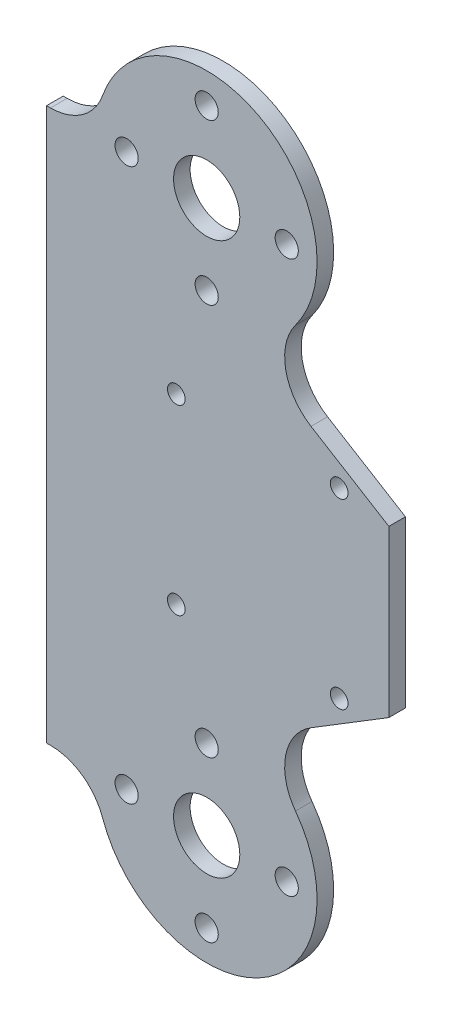
ISO-10303-21;
HEADER;
FILE_DESCRIPTION(('STEP AP214'),'2;1');
FILE_NAME('part.step','',(''),(''),'','','');
FILE_SCHEMA(('AUTOMOTIVE_DESIGN { 1 0 10303 214 1 1 1 1 }'));
ENDSEC;
DATA;
#1=APPLICATION_CONTEXT('core data for automotive mechanical design processes');
#2=APPLICATION_PROTOCOL_DEFINITION('international standard','automotive_design',2000,#1);
#3=PRODUCT_CONTEXT('',#1,'mechanical');
#4=PRODUCT('Part','Part','',(#3));
#5=PRODUCT_RELATED_PRODUCT_CATEGORY('part','',(#4));
#6=PRODUCT_DEFINITION_FORMATION('','',#4);
#7=PRODUCT_DEFINITION_CONTEXT('part definition',#1,'design');
#8=PRODUCT_DEFINITION('design','',#6,#7);
#9=PRODUCT_DEFINITION_SHAPE('','',#8);
#10=(LENGTH_UNIT() NAMED_UNIT(*) SI_UNIT(.MILLI.,.METRE.));
#11=(NAMED_UNIT(*) PLANE_ANGLE_UNIT() SI_UNIT($,.RADIAN.));
#12=(NAMED_UNIT(*) SI_UNIT($,.STERADIAN.) SOLID_ANGLE_UNIT());
#13=UNCERTAINTY_MEASURE_WITH_UNIT(LENGTH_MEASURE(1.E-05),#10,'distance_accuracy_value','');
#14=(GEOMETRIC_REPRESENTATION_CONTEXT(3) GLOBAL_UNCERTAINTY_ASSIGNED_CONTEXT((#13)) GLOBAL_UNIT_ASSIGNED_CONTEXT((#10,
#11,#12)) REPRESENTATION_CONTEXT('',''));
#15=CARTESIAN_POINT('',(0.,0.,0.));
#16=DIRECTION('',(0.,0.,1.));
#17=DIRECTION('',(1.,0.,0.));
#18=AXIS2_PLACEMENT_3D('',#15,#16,#17);
#19=CARTESIAN_POINT('',(-29.,-50.,3.));
#20=DIRECTION('',(0.,1.,0.));
#21=DIRECTION('',(0.,0.,1.));
#22=AXIS2_PLACEMENT_3D('',#19,#20,#21);
#23=PLANE('',#22);
#24=DIRECTION('',(0.,0.,-1.));
#25=VECTOR('',#24,1.);
#26=CARTESIAN_POINT('',(0.,-50.,3.));
#27=LINE('',#26,#25);
#28=CARTESIAN_POINT('',(0.,-50.,3.));
#29=VERTEX_POINT('',#28);
#30=CARTESIAN_POINT('',(0.,-50.,0.));
#31=VERTEX_POINT('',#30);
#32=EDGE_CURVE('E162',#29,#31,#27,.T.);
#33=ORIENTED_EDGE('',*,*,#32,.T.);
#34=DIRECTION('',(-1.,0.,0.));
#35=VECTOR('',#34,1.);
#36=CARTESIAN_POINT('',(0.,-50.,0.));
#37=LINE('',#36,#35);
#38=CARTESIAN_POINT('',(0.71572875253809,-50.,0.));
#39=VERTEX_POINT('',#38);
#40=EDGE_CURVE('E126',#39,#31,#37,.T.);
#41=ORIENTED_EDGE('',*,*,#40,.F.);
#42=DIRECTION('',(0.,0.,1.));
#43=VECTOR('',#42,1.);
#44=CARTESIAN_POINT('',(0.715728752538087,-50.,-56.5685424949239));
#45=LINE('',#44,#43);
#46=CARTESIAN_POINT('',(0.71572875253809,-50.,3.));
#47=VERTEX_POINT('',#46);
#48=EDGE_CURVE('E266',#39,#47,#45,.T.);
#49=ORIENTED_EDGE('',*,*,#48,.T.);
#50=DIRECTION('',(1.,0.,0.));
#51=VECTOR('',#50,1.);
#52=CARTESIAN_POINT('',(-29.,-50.,3.));
#53=LINE('',#52,#51);
#54=EDGE_CURVE('E134',#29,#47,#53,.T.);
#55=ORIENTED_EDGE('',*,*,#54,.F.);
#56=EDGE_LOOP('',(#33,#41,#49,#55));
#57=FACE_BOUND('',#56,.T.);
#58=ADVANCED_FACE('F17',(#57),#23,.F.);
#59=CARTESIAN_POINT('',(-29.,50.,3.));
#60=DIRECTION('',(0.,1.,0.));
#61=DIRECTION('',(0.,0.,1.));
#62=AXIS2_PLACEMENT_3D('',#59,#60,#61);
#63=PLANE('',#62);
#64=DIRECTION('',(0.,0.,1.));
#65=VECTOR('',#64,1.);
#66=CARTESIAN_POINT('',(0.715728752538082,50.,-56.5685424949239));
#67=LINE('',#66,#65);
#68=CARTESIAN_POINT('',(0.715728752538088,50.,3.));
#69=VERTEX_POINT('',#68);
#70=CARTESIAN_POINT('',(0.715728752538088,50.,0.));
#71=VERTEX_POINT('',#70);
#72=EDGE_CURVE('E115',#69,#71,#67,.F.);
#73=ORIENTED_EDGE('',*,*,#72,.T.);
#74=DIRECTION('',(-1.,0.,0.));
#75=VECTOR('',#74,1.);
#76=CARTESIAN_POINT('',(0.,50.,0.));
#77=LINE('',#76,#75);
#78=CARTESIAN_POINT('',(0.,50.,0.));
#79=VERTEX_POINT('',#78);
#80=EDGE_CURVE('E94',#79,#71,#77,.F.);
#81=ORIENTED_EDGE('',*,*,#80,.F.);
#82=DIRECTION('',(0.,0.,-1.));
#83=VECTOR('',#82,1.);
#84=CARTESIAN_POINT('',(0.,50.,3.));
#85=LINE('',#84,#83);
#86=CARTESIAN_POINT('',(0.,50.,3.));
#87=VERTEX_POINT('',#86);
#88=EDGE_CURVE('E161',#79,#87,#85,.F.);
#89=ORIENTED_EDGE('',*,*,#88,.T.);
#90=DIRECTION('',(1.,0.,0.));
#91=VECTOR('',#90,1.);
#92=CARTESIAN_POINT('',(-29.,50.,3.));
#93=LINE('',#92,#91);
#94=EDGE_CURVE('E35',#87,#69,#93,.T.);
#95=ORIENTED_EDGE('',*,*,#94,.T.);
#96=EDGE_LOOP('',(#73,#81,#89,#95));
#97=FACE_BOUND('',#96,.T.);
#98=ADVANCED_FACE('F390',(#97),#63,.T.);
#99=CARTESIAN_POINT('',(0.,0.,0.));
#100=DIRECTION('',(0.,0.,-1.));
#101=DIRECTION('',(-1.,0.,0.));
#102=AXIS2_PLACEMENT_3D('',#99,#100,#101);
#103=PLANE('',#102);
#104=CARTESIAN_POINT('',(29.,50.,0.));
#105=DIRECTION('',(0.,0.,1.));
#106=DIRECTION('',(1.,0.,0.));
#107=AXIS2_PLACEMENT_3D('',#104,#105,#106);
#108=CIRCLE('',#107,6.00000000000001);
#109=CARTESIAN_POINT('',(35.,50.,0.));
#110=VERTEX_POINT('',#109);
#111=EDGE_CURVE('E233',#110,#110,#108,.T.);
#112=ORIENTED_EDGE('',*,*,#111,.T.);
#113=EDGE_LOOP('',(#112));
#114=FACE_BOUND('',#113,.T.);
#115=CARTESIAN_POINT('',(29.,-50.,0.));
#116=DIRECTION('',(0.,0.,1.));
#117=DIRECTION('',(1.,0.,0.));
#118=AXIS2_PLACEMENT_3D('',#115,#116,#117);
#119=CIRCLE('',#118,6.00000000000001);
#120=CARTESIAN_POINT('',(35.,-50.,0.));
#121=VERTEX_POINT('',#120);
#122=EDGE_CURVE('E236',#121,#121,#119,.T.);
#123=ORIENTED_EDGE('',*,*,#122,.T.);
#124=EDGE_LOOP('',(#123));
#125=FACE_BOUND('',#124,.T.);
#126=CARTESIAN_POINT('',(29.,-35.5,0.));
#127=DIRECTION('',(0.,0.,1.));
#128=DIRECTION('',(1.,0.,0.));
#129=AXIS2_PLACEMENT_3D('',#126,#127,#128);
#130=CIRCLE('',#129,2.09999999999999);
#131=CARTESIAN_POINT('',(31.1,-35.5,0.));
#132=VERTEX_POINT('',#131);
#133=EDGE_CURVE('E239',#132,#132,#130,.T.);
#134=ORIENTED_EDGE('',*,*,#133,.T.);
#135=EDGE_LOOP('',(#134));
#136=FACE_BOUND('',#135,.T.);
#137=CARTESIAN_POINT('',(29.,64.5,0.));
#138=DIRECTION('',(0.,0.,1.));
#139=DIRECTION('',(1.,0.,0.));
#140=AXIS2_PLACEMENT_3D('',#137,#138,#139);
#141=CIRCLE('',#140,2.1);
#142=CARTESIAN_POINT('',(31.1,64.5,0.));
#143=VERTEX_POINT('',#142);
#144=EDGE_CURVE('E242',#143,#143,#141,.T.);
#145=ORIENTED_EDGE('',*,*,#144,.T.);
#146=EDGE_LOOP('',(#145));
#147=FACE_BOUND('',#146,.T.);
#148=CARTESIAN_POINT('',(14.5,-50.,0.));
#149=DIRECTION('',(0.,0.,1.));
#150=DIRECTION('',(1.,0.,0.));
#151=AXIS2_PLACEMENT_3D('',#148,#149,#150);
#152=CIRCLE('',#151,2.1);
#153=CARTESIAN_POINT('',(16.6,-50.,0.));
#154=VERTEX_POINT('',#153);
#155=EDGE_CURVE('E245',#154,#154,#152,.T.);
#156=ORIENTED_EDGE('',*,*,#155,.T.);
#157=EDGE_LOOP('',(#156));
#158=FACE_BOUND('',#157,.T.);
#159=CARTESIAN_POINT('',(29.,-64.5,0.));
#160=DIRECTION('',(0.,0.,1.));
#161=DIRECTION('',(1.,0.,0.));
#162=AXIS2_PLACEMENT_3D('',#159,#160,#161);
#163=CIRCLE('',#162,2.1);
#164=CARTESIAN_POINT('',(31.1,-64.5,0.));
#165=VERTEX_POINT('',#164);
#166=EDGE_CURVE('E248',#165,#165,#163,.T.);
#167=ORIENTED_EDGE('',*,*,#166,.T.);
#168=EDGE_LOOP('',(#167));
#169=FACE_BOUND('',#168,.T.);
#170=CARTESIAN_POINT('',(43.5,-50.,0.));
#171=DIRECTION('',(0.,0.,1.));
#172=DIRECTION('',(1.,0.,0.));
#173=AXIS2_PLACEMENT_3D('',#170,#171,#172);
#174=CIRCLE('',#173,2.1);
#175=CARTESIAN_POINT('',(45.6,-50.,0.));
#176=VERTEX_POINT('',#175);
#177=EDGE_CURVE('E251',#176,#176,#174,.T.);
#178=ORIENTED_EDGE('',*,*,#177,.T.);
#179=EDGE_LOOP('',(#178));
#180=FACE_BOUND('',#179,.T.);
#181=CARTESIAN_POINT('',(43.5,50.,0.));
#182=DIRECTION('',(0.,0.,1.));
#183=DIRECTION('',(1.,0.,0.));
#184=AXIS2_PLACEMENT_3D('',#181,#182,#183);
#185=CIRCLE('',#184,2.09999999999999);
#186=CARTESIAN_POINT('',(45.6,50.,0.));
#187=VERTEX_POINT('',#186);
#188=EDGE_CURVE('E254',#187,#187,#185,.T.);
#189=ORIENTED_EDGE('',*,*,#188,.T.);
#190=EDGE_LOOP('',(#189));
#191=FACE_BOUND('',#190,.T.);
#192=CARTESIAN_POINT('',(14.5,50.,0.));
#193=DIRECTION('',(0.,0.,1.));
#194=DIRECTION('',(1.,0.,0.));
#195=AXIS2_PLACEMENT_3D('',#192,#193,#194);
#196=CIRCLE('',#195,2.1);
#197=CARTESIAN_POINT('',(16.6,50.,0.));
#198=VERTEX_POINT('',#197);
#199=EDGE_CURVE('E257',#198,#198,#196,.T.);
#200=ORIENTED_EDGE('',*,*,#199,.T.);
#201=EDGE_LOOP('',(#200));
#202=FACE_BOUND('',#201,.T.);
#203=CARTESIAN_POINT('',(29.,35.5,0.));
#204=DIRECTION('',(0.,0.,1.));
#205=DIRECTION('',(1.,0.,0.));
#206=AXIS2_PLACEMENT_3D('',#203,#204,#205);
#207=CIRCLE('',#206,2.09999999999999);
#208=CARTESIAN_POINT('',(31.1,35.5,0.));
#209=VERTEX_POINT('',#208);
#210=EDGE_CURVE('E171',#209,#209,#207,.T.);
#211=ORIENTED_EDGE('',*,*,#210,.T.);
#212=EDGE_LOOP('',(#211));
#213=FACE_BOUND('',#212,.T.);
#214=CARTESIAN_POINT('',(53.0000000000001,-16.4999999999999,0.));
#215=DIRECTION('',(0.,0.,1.));
#216=DIRECTION('',(1.,0.,0.));
#217=AXIS2_PLACEMENT_3D('',#214,#215,#216);
#218=CIRCLE('',#217,1.6);
#219=CARTESIAN_POINT('',(54.6000000000001,-16.4999999999999,0.));
#220=VERTEX_POINT('',#219);
#221=EDGE_CURVE('E125',#220,#220,#218,.T.);
#222=ORIENTED_EDGE('',*,*,#221,.T.);
#223=EDGE_LOOP('',(#222));
#224=FACE_BOUND('',#223,.T.);
#225=CARTESIAN_POINT('',(23.5000000000001,-16.5,0.));
#226=DIRECTION('',(0.,0.,1.));
#227=DIRECTION('',(1.,0.,0.));
#228=AXIS2_PLACEMENT_3D('',#225,#226,#227);
#229=CIRCLE('',#228,1.6);
#230=CARTESIAN_POINT('',(25.1000000000001,-16.5,0.));
#231=VERTEX_POINT('',#230);
#232=EDGE_CURVE('E275',#231,#231,#229,.T.);
#233=ORIENTED_EDGE('',*,*,#232,.T.);
#234=EDGE_LOOP('',(#233));
#235=FACE_BOUND('',#234,.T.);
#236=CARTESIAN_POINT('',(23.5,16.5,0.));
#237=DIRECTION('',(0.,0.,1.));
#238=DIRECTION('',(1.,0.,0.));
#239=AXIS2_PLACEMENT_3D('',#236,#237,#238);
#240=CIRCLE('',#239,1.6);
#241=CARTESIAN_POINT('',(25.1,16.5,0.));
#242=VERTEX_POINT('',#241);
#243=EDGE_CURVE('E277',#242,#242,#240,.T.);
#244=ORIENTED_EDGE('',*,*,#243,.T.);
#245=EDGE_LOOP('',(#244));
#246=FACE_BOUND('',#245,.T.);
#247=CARTESIAN_POINT('',(53.,16.5000000000001,0.));
#248=DIRECTION('',(0.,0.,1.));
#249=DIRECTION('',(1.,0.,0.));
#250=AXIS2_PLACEMENT_3D('',#247,#248,#249);
#251=CIRCLE('',#250,1.6);
#252=CARTESIAN_POINT('',(54.6,16.5000000000001,0.));
#253=VERTEX_POINT('',#252);
#254=EDGE_CURVE('E20',#253,#253,#251,.T.);
#255=ORIENTED_EDGE('',*,*,#254,.T.);
#256=EDGE_LOOP('',(#255));
#257=FACE_BOUND('',#256,.T.);
#258=CARTESIAN_POINT('',(0.715728752538093,-60.,0.));
#259=DIRECTION('',(0.,0.,1.));
#260=DIRECTION('',(1.,0.,0.));
#261=AXIS2_PLACEMENT_3D('',#258,#259,#260);
#262=CIRCLE('',#261,10.);
#263=CARTESIAN_POINT('',(10.1438191683587,-56.6666666666667,0.));
#264=VERTEX_POINT('',#263);
#265=EDGE_CURVE('E167',#264,#39,#262,.T.);
#266=ORIENTED_EDGE('',*,*,#265,.T.);
#267=ORIENTED_EDGE('',*,*,#40,.T.);
#268=DIRECTION('',(0.,1.,0.));
#269=VECTOR('',#268,1.);
#270=CARTESIAN_POINT('',(0.,-76.6594091653374,0.));
#271=LINE('',#270,#269);
#272=EDGE_CURVE('E159',#31,#79,#271,.T.);
#273=ORIENTED_EDGE('',*,*,#272,.T.);
#274=ORIENTED_EDGE('',*,*,#80,.T.);
#275=CARTESIAN_POINT('',(0.715728752538093,60.,0.));
#276=DIRECTION('',(0.,0.,1.));
#277=DIRECTION('',(1.,0.,0.));
#278=AXIS2_PLACEMENT_3D('',#275,#276,#277);
#279=CIRCLE('',#278,10.);
#280=CARTESIAN_POINT('',(10.1438191683587,56.6666666666667,0.));
#281=VERTEX_POINT('',#280);
#282=EDGE_CURVE('E109',#71,#281,#279,.T.);
#283=ORIENTED_EDGE('',*,*,#282,.T.);
#284=CARTESIAN_POINT('',(29.,50.,0.));
#285=DIRECTION('',(0.,0.,1.));
#286=DIRECTION('',(1.,0.,0.));
#287=AXIS2_PLACEMENT_3D('',#284,#285,#286);
#288=CIRCLE('',#287,20.);
#289=CARTESIAN_POINT('',(45.0842166639863,38.1131175531199,0.));
#290=VERTEX_POINT('',#289);
#291=EDGE_CURVE('E99',#290,#281,#288,.T.);
#292=ORIENTED_EDGE('',*,*,#291,.F.);
#293=CARTESIAN_POINT('',(53.1263249959794,32.1696763296798,0.));
#294=DIRECTION('',(0.,0.,1.));
#295=DIRECTION('',(1.,0.,0.));
#296=AXIS2_PLACEMENT_3D('',#293,#294,#295);
#297=CIRCLE('',#296,9.99999999999999);
#298=CARTESIAN_POINT('',(47.899755020674,23.6442457661695,0.));
#299=VERTEX_POINT('',#298);
#300=EDGE_CURVE('E153',#290,#299,#297,.T.);
#301=ORIENTED_EDGE('',*,*,#300,.T.);
#302=DIRECTION('',(-0.852543056351032,0.522656997530542,0.));
#303=VECTOR('',#302,1.);
#304=CARTESIAN_POINT('',(62.,15.,0.));
#305=LINE('',#304,#303);
#306=CARTESIAN_POINT('',(62.,15.,0.));
#307=VERTEX_POINT('',#306);
#308=EDGE_CURVE('E151',#307,#299,#305,.T.);
#309=ORIENTED_EDGE('',*,*,#308,.F.);
#310=DIRECTION('',(0.,1.,0.));
#311=VECTOR('',#310,1.);
#312=CARTESIAN_POINT('',(62.,15.,0.));
#313=LINE('',#312,#311);
#314=CARTESIAN_POINT('',(62.,-15.,0.));
#315=VERTEX_POINT('',#314);
#316=EDGE_CURVE('E145',#315,#307,#313,.T.);
#317=ORIENTED_EDGE('',*,*,#316,.F.);
#318=DIRECTION('',(0.852543056351032,0.522656997530541,0.));
#319=VECTOR('',#318,1.);
#320=CARTESIAN_POINT('',(62.,-15.,0.));
#321=LINE('',#320,#319);
#322=CARTESIAN_POINT('',(47.899755020674,-23.6442457661695,0.));
#323=VERTEX_POINT('',#322);
#324=EDGE_CURVE('E138',#323,#315,#321,.T.);
#325=ORIENTED_EDGE('',*,*,#324,.F.);
#326=CARTESIAN_POINT('',(53.1263249959794,-32.1696763296798,0.));
#327=DIRECTION('',(0.,0.,1.));
#328=DIRECTION('',(1.,0.,0.));
#329=AXIS2_PLACEMENT_3D('',#326,#327,#328);
#330=CIRCLE('',#329,9.99999999999999);
#331=CARTESIAN_POINT('',(45.0842166639863,-38.1131175531199,0.));
#332=VERTEX_POINT('',#331);
#333=EDGE_CURVE('E268',#323,#332,#330,.T.);
#334=ORIENTED_EDGE('',*,*,#333,.T.);
#335=CARTESIAN_POINT('',(29.,-50.,0.));
#336=DIRECTION('',(0.,0.,1.));
#337=DIRECTION('',(1.,0.,0.));
#338=AXIS2_PLACEMENT_3D('',#335,#336,#337);
#339=CIRCLE('',#338,20.);
#340=EDGE_CURVE('E264',#264,#332,#339,.T.);
#341=ORIENTED_EDGE('',*,*,#340,.F.);
#342=EDGE_LOOP('',(#266,#267,#273,#274,#283,#292,#301,#309,#317,#325,#334,#341));
#343=FACE_BOUND('',#342,.T.);
#344=ADVANCED_FACE('F111',(#114,#125,#136,#147,#158,#169,#180,#191,#202,#213,#224,#235,#246,
#257,#343),#103,.T.);
#345=CARTESIAN_POINT('',(53.,16.5000000000001,0.));
#346=DIRECTION('',(0.,0.,1.));
#347=DIRECTION('',(1.,0.,0.));
#348=AXIS2_PLACEMENT_3D('',#345,#346,#347);
#349=CYLINDRICAL_SURFACE('',#348,1.6);
#350=ORIENTED_EDGE('',*,*,#254,.F.);
#351=EDGE_LOOP('',(#350));
#352=FACE_BOUND('',#351,.T.);
#353=CARTESIAN_POINT('',(53.,16.5000000000001,3.));
#354=DIRECTION('',(0.,0.,1.));
#355=DIRECTION('',(1.,0.,0.));
#356=AXIS2_PLACEMENT_3D('',#353,#354,#355);
#357=CIRCLE('',#356,1.6);
#358=CARTESIAN_POINT('',(54.6,16.5000000000001,3.));
#359=VERTEX_POINT('',#358);
#360=EDGE_CURVE('E230',#359,#359,#357,.T.);
#361=ORIENTED_EDGE('',*,*,#360,.T.);
#362=EDGE_LOOP('',(#361));
#363=FACE_BOUND('',#362,.T.);
#364=ADVANCED_FACE('F285',(#352,#363),#349,.F.);
#365=CARTESIAN_POINT('',(23.5,16.5,0.));
#366=DIRECTION('',(0.,0.,1.));
#367=DIRECTION('',(1.,0.,0.));
#368=AXIS2_PLACEMENT_3D('',#365,#366,#367);
#369=CYLINDRICAL_SURFACE('',#368,1.6);
#370=ORIENTED_EDGE('',*,*,#243,.F.);
#371=EDGE_LOOP('',(#370));
#372=FACE_BOUND('',#371,.T.);
#373=CARTESIAN_POINT('',(23.5,16.5,3.));
#374=DIRECTION('',(0.,0.,1.));
#375=DIRECTION('',(1.,0.,0.));
#376=AXIS2_PLACEMENT_3D('',#373,#374,#375);
#377=CIRCLE('',#376,1.6);
#378=CARTESIAN_POINT('',(25.1,16.5,3.));
#379=VERTEX_POINT('',#378);
#380=EDGE_CURVE('E227',#379,#379,#377,.T.);
#381=ORIENTED_EDGE('',*,*,#380,.T.);
#382=EDGE_LOOP('',(#381));
#383=FACE_BOUND('',#382,.T.);
#384=ADVANCED_FACE('F288',(#372,#383),#369,.F.);
#385=CARTESIAN_POINT('',(23.5000000000001,-16.5,0.));
#386=DIRECTION('',(0.,0.,1.));
#387=DIRECTION('',(1.,0.,0.));
#388=AXIS2_PLACEMENT_3D('',#385,#386,#387);
#389=CYLINDRICAL_SURFACE('',#388,1.6);
#390=ORIENTED_EDGE('',*,*,#232,.F.);
#391=EDGE_LOOP('',(#390));
#392=FACE_BOUND('',#391,.T.);
#393=CARTESIAN_POINT('',(23.5000000000001,-16.5,3.));
#394=DIRECTION('',(0.,0.,1.));
#395=DIRECTION('',(1.,0.,0.));
#396=AXIS2_PLACEMENT_3D('',#393,#394,#395);
#397=CIRCLE('',#396,1.6);
#398=CARTESIAN_POINT('',(25.1000000000001,-16.5,3.));
#399=VERTEX_POINT('',#398);
#400=EDGE_CURVE('E224',#399,#399,#397,.T.);
#401=ORIENTED_EDGE('',*,*,#400,.T.);
#402=EDGE_LOOP('',(#401));
#403=FACE_BOUND('',#402,.T.);
#404=ADVANCED_FACE('F381',(#392,#403),#389,.F.);
#405=CARTESIAN_POINT('',(53.0000000000001,-16.4999999999999,0.));
#406=DIRECTION('',(0.,0.,1.));
#407=DIRECTION('',(1.,0.,0.));
#408=AXIS2_PLACEMENT_3D('',#405,#406,#407);
#409=CYLINDRICAL_SURFACE('',#408,1.6);
#410=ORIENTED_EDGE('',*,*,#221,.F.);
#411=EDGE_LOOP('',(#410));
#412=FACE_BOUND('',#411,.T.);
#413=CARTESIAN_POINT('',(53.0000000000001,-16.4999999999999,3.));
#414=DIRECTION('',(0.,0.,1.));
#415=DIRECTION('',(1.,0.,0.));
#416=AXIS2_PLACEMENT_3D('',#413,#414,#415);
#417=CIRCLE('',#416,1.6);
#418=CARTESIAN_POINT('',(54.6000000000001,-16.4999999999999,3.));
#419=VERTEX_POINT('',#418);
#420=EDGE_CURVE('E221',#419,#419,#417,.T.);
#421=ORIENTED_EDGE('',*,*,#420,.T.);
#422=EDGE_LOOP('',(#421));
#423=FACE_BOUND('',#422,.T.);
#424=ADVANCED_FACE('F378',(#412,#423),#409,.F.);
#425=CARTESIAN_POINT('',(0.715728752538093,60.,-56.5685424949239));
#426=DIRECTION('',(0.,0.,1.));
#427=DIRECTION('',(1.,0.,0.));
#428=AXIS2_PLACEMENT_3D('',#425,#426,#427);
#429=CYLINDRICAL_SURFACE('',#428,10.);
#430=ORIENTED_EDGE('',*,*,#72,.F.);
#431=CARTESIAN_POINT('',(0.715728752538093,60.,3.));
#432=DIRECTION('',(0.,0.,1.));
#433=DIRECTION('',(1.,0.,0.));
#434=AXIS2_PLACEMENT_3D('',#431,#432,#433);
#435=CIRCLE('',#434,10.);
#436=CARTESIAN_POINT('',(10.1438191683587,56.6666666666667,3.));
#437=VERTEX_POINT('',#436);
#438=EDGE_CURVE('E119',#69,#437,#435,.T.);
#439=ORIENTED_EDGE('',*,*,#438,.T.);
#440=DIRECTION('',(0.,0.,1.));
#441=VECTOR('',#440,1.);
#442=CARTESIAN_POINT('',(10.1438191683587,56.6666666666667,-56.5685424949239));
#443=LINE('',#442,#441);
#444=EDGE_CURVE('E102',#281,#437,#443,.T.);
#445=ORIENTED_EDGE('',*,*,#444,.F.);
#446=ORIENTED_EDGE('',*,*,#282,.F.);
#447=EDGE_LOOP('',(#430,#439,#445,#446));
#448=FACE_BOUND('',#447,.T.);
#449=ADVANCED_FACE('F118',(#448),#429,.F.);
#450=CARTESIAN_POINT('',(29.,50.,-56.5685424949239));
#451=DIRECTION('',(0.,0.,1.));
#452=DIRECTION('',(1.,0.,0.));
#453=AXIS2_PLACEMENT_3D('',#450,#451,#452);
#454=CYLINDRICAL_SURFACE('',#453,20.);
#455=CARTESIAN_POINT('',(29.,50.,3.));
#456=DIRECTION('',(0.,0.,1.));
#457=DIRECTION('',(1.,0.,0.));
#458=AXIS2_PLACEMENT_3D('',#455,#456,#457);
#459=CIRCLE('',#458,20.);
#460=CARTESIAN_POINT('',(45.0842166639863,38.1131175531199,3.));
#461=VERTEX_POINT('',#460);
#462=EDGE_CURVE('E218',#437,#461,#459,.F.);
#463=ORIENTED_EDGE('',*,*,#462,.T.);
#464=DIRECTION('',(0.,0.,1.));
#465=VECTOR('',#464,1.);
#466=CARTESIAN_POINT('',(45.0842166639863,38.1131175531199,-56.5685424949239));
#467=LINE('',#466,#465);
#468=EDGE_CURVE('E105',#461,#290,#467,.F.);
#469=ORIENTED_EDGE('',*,*,#468,.T.);
#470=ORIENTED_EDGE('',*,*,#291,.T.);
#471=ORIENTED_EDGE('',*,*,#444,.T.);
#472=EDGE_LOOP('',(#463,#469,#470,#471));
#473=FACE_BOUND('',#472,.T.);
#474=ADVANCED_FACE('F100',(#473),#454,.T.);
#475=CARTESIAN_POINT('',(53.1263249959794,32.1696763296798,-56.5685424949239));
#476=DIRECTION('',(0.,0.,1.));
#477=DIRECTION('',(1.,0.,0.));
#478=AXIS2_PLACEMENT_3D('',#475,#476,#477);
#479=CYLINDRICAL_SURFACE('',#478,9.99999999999999);
#480=DIRECTION('',(0.,0.,1.));
#481=VECTOR('',#480,1.);
#482=CARTESIAN_POINT('',(47.899755020674,23.6442457661695,73.4893601160183));
#483=LINE('',#482,#481);
#484=CARTESIAN_POINT('',(47.899755020674,23.6442457661695,3.));
#485=VERTEX_POINT('',#484);
#486=EDGE_CURVE('E148',#299,#485,#483,.T.);
#487=ORIENTED_EDGE('',*,*,#486,.F.);
#488=ORIENTED_EDGE('',*,*,#300,.F.);
#489=ORIENTED_EDGE('',*,*,#468,.F.);
#490=CARTESIAN_POINT('',(53.1263249959794,32.1696763296798,3.));
#491=DIRECTION('',(0.,0.,1.));
#492=DIRECTION('',(1.,0.,0.));
#493=AXIS2_PLACEMENT_3D('',#490,#491,#492);
#494=CIRCLE('',#493,9.99999999999999);
#495=EDGE_CURVE('E214',#461,#485,#494,.T.);
#496=ORIENTED_EDGE('',*,*,#495,.T.);
#497=EDGE_LOOP('',(#487,#488,#489,#496));
#498=FACE_BOUND('',#497,.T.);
#499=ADVANCED_FACE('F369',(#498),#479,.F.);
#500=CARTESIAN_POINT('',(62.,15.,73.4893601160183));
#501=DIRECTION('',(0.522656997530542,0.852543056351032,0.));
#502=DIRECTION('',(-0.852543056351032,0.522656997530542,0.));
#503=AXIS2_PLACEMENT_3D('',#500,#501,#502);
#504=PLANE('',#503);
#505=DIRECTION('',(0.852543056351032,-0.522656997530542,0.));
#506=VECTOR('',#505,1.);
#507=CARTESIAN_POINT('',(47.899755020674,23.6442457661695,3.));
#508=LINE('',#507,#506);
#509=CARTESIAN_POINT('',(62.,15.,3.));
#510=VERTEX_POINT('',#509);
#511=EDGE_CURVE('E217',#485,#510,#508,.T.);
#512=ORIENTED_EDGE('',*,*,#511,.T.);
#513=DIRECTION('',(0.,0.,1.));
#514=VECTOR('',#513,1.);
#515=CARTESIAN_POINT('',(62.,15.,73.4893601160183));
#516=LINE('',#515,#514);
#517=EDGE_CURVE('E142',#307,#510,#516,.T.);
#518=ORIENTED_EDGE('',*,*,#517,.F.);
#519=ORIENTED_EDGE('',*,*,#308,.T.);
#520=ORIENTED_EDGE('',*,*,#486,.T.);
#521=EDGE_LOOP('',(#512,#518,#519,#520));
#522=FACE_BOUND('',#521,.T.);
#523=ADVANCED_FACE('F365',(#522),#504,.T.);
#524=CARTESIAN_POINT('',(62.,15.,73.4893601160183));
#525=DIRECTION('',(1.,0.,0.));
#526=DIRECTION('',(0.,1.,0.));
#527=AXIS2_PLACEMENT_3D('',#524,#525,#526);
#528=PLANE('',#527);
#529=ORIENTED_EDGE('',*,*,#316,.T.);
#530=ORIENTED_EDGE('',*,*,#517,.T.);
#531=DIRECTION('',(0.,1.,0.));
#532=VECTOR('',#531,1.);
#533=CARTESIAN_POINT('',(62.,0.,3.));
#534=LINE('',#533,#532);
#535=CARTESIAN_POINT('',(62.,-15.,3.));
#536=VERTEX_POINT('',#535);
#537=EDGE_CURVE('E419',#510,#536,#534,.F.);
#538=ORIENTED_EDGE('',*,*,#537,.T.);
#539=DIRECTION('',(0.,0.,1.));
#540=VECTOR('',#539,1.);
#541=CARTESIAN_POINT('',(62.,-15.,73.4893601160183));
#542=LINE('',#541,#540);
#543=EDGE_CURVE('E141',#315,#536,#542,.T.);
#544=ORIENTED_EDGE('',*,*,#543,.F.);
#545=EDGE_LOOP('',(#529,#530,#538,#544));
#546=FACE_BOUND('',#545,.T.);
#547=ADVANCED_FACE('F361',(#546),#528,.T.);
#548=CARTESIAN_POINT('',(62.,-15.,73.4893601160183));
#549=DIRECTION('',(0.522656997530541,-0.852543056351032,0.));
#550=DIRECTION('',(0.852543056351032,0.522656997530541,0.));
#551=AXIS2_PLACEMENT_3D('',#548,#549,#550);
#552=PLANE('',#551);
#553=ORIENTED_EDGE('',*,*,#324,.T.);
#554=ORIENTED_EDGE('',*,*,#543,.T.);
#555=DIRECTION('',(-0.852543056351032,-0.522656997530542,0.));
#556=VECTOR('',#555,1.);
#557=CARTESIAN_POINT('',(62.,-15.,3.));
#558=LINE('',#557,#556);
#559=CARTESIAN_POINT('',(47.899755020674,-23.6442457661695,2.99999999999999));
#560=VERTEX_POINT('',#559);
#561=EDGE_CURVE('E213',#536,#560,#558,.T.);
#562=ORIENTED_EDGE('',*,*,#561,.T.);
#563=DIRECTION('',(0.,0.,1.));
#564=VECTOR('',#563,1.);
#565=CARTESIAN_POINT('',(47.899755020674,-23.6442457661695,-56.5685424949239));
#566=LINE('',#565,#564);
#567=EDGE_CURVE('E271',#560,#323,#566,.F.);
#568=ORIENTED_EDGE('',*,*,#567,.T.);
#569=EDGE_LOOP('',(#553,#554,#562,#568));
#570=FACE_BOUND('',#569,.T.);
#571=ADVANCED_FACE('F357',(#570),#552,.T.);
#572=CARTESIAN_POINT('',(53.1263249959794,-32.1696763296798,-56.5685424949239));
#573=DIRECTION('',(0.,0.,1.));
#574=DIRECTION('',(1.,0.,0.));
#575=AXIS2_PLACEMENT_3D('',#572,#573,#574);
#576=CYLINDRICAL_SURFACE('',#575,9.99999999999999);
#577=ORIENTED_EDGE('',*,*,#567,.F.);
#578=CARTESIAN_POINT('',(53.1263249959794,-32.1696763296798,3.));
#579=DIRECTION('',(0.,0.,1.));
#580=DIRECTION('',(1.,0.,0.));
#581=AXIS2_PLACEMENT_3D('',#578,#579,#580);
#582=CIRCLE('',#581,9.99999999999999);
#583=CARTESIAN_POINT('',(45.0842166639863,-38.1131175531199,3.));
#584=VERTEX_POINT('',#583);
#585=EDGE_CURVE('E210',#560,#584,#582,.T.);
#586=ORIENTED_EDGE('',*,*,#585,.T.);
#587=DIRECTION('',(0.,0.,1.));
#588=VECTOR('',#587,1.);
#589=CARTESIAN_POINT('',(45.0842166639863,-38.1131175531199,-56.5685424949239));
#590=LINE('',#589,#588);
#591=EDGE_CURVE('E267',#332,#584,#590,.T.);
#592=ORIENTED_EDGE('',*,*,#591,.F.);
#593=ORIENTED_EDGE('',*,*,#333,.F.);
#594=EDGE_LOOP('',(#577,#586,#592,#593));
#595=FACE_BOUND('',#594,.T.);
#596=ADVANCED_FACE('F353',(#595),#576,.F.);
#597=CARTESIAN_POINT('',(29.,-50.,-56.5685424949239));
#598=DIRECTION('',(0.,0.,1.));
#599=DIRECTION('',(1.,0.,0.));
#600=AXIS2_PLACEMENT_3D('',#597,#598,#599);
#601=CYLINDRICAL_SURFACE('',#600,20.);
#602=CARTESIAN_POINT('',(29.,-50.,3.));
#603=DIRECTION('',(0.,0.,1.));
#604=DIRECTION('',(1.,0.,0.));
#605=AXIS2_PLACEMENT_3D('',#602,#603,#604);
#606=CIRCLE('',#605,20.);
#607=CARTESIAN_POINT('',(10.1438191683587,-56.6666666666667,3.));
#608=VERTEX_POINT('',#607);
#609=EDGE_CURVE('E208',#584,#608,#606,.F.);
#610=ORIENTED_EDGE('',*,*,#609,.T.);
#611=DIRECTION('',(0.,0.,1.));
#612=VECTOR('',#611,1.);
#613=CARTESIAN_POINT('',(10.1438191683587,-56.6666666666667,-56.5685424949239));
#614=LINE('',#613,#612);
#615=EDGE_CURVE('E263',#608,#264,#614,.F.);
#616=ORIENTED_EDGE('',*,*,#615,.T.);
#617=ORIENTED_EDGE('',*,*,#340,.T.);
#618=ORIENTED_EDGE('',*,*,#591,.T.);
#619=EDGE_LOOP('',(#610,#616,#617,#618));
#620=FACE_BOUND('',#619,.T.);
#621=ADVANCED_FACE('F349',(#620),#601,.T.);
#622=CARTESIAN_POINT('',(0.715728752538093,-60.,-56.5685424949239));
#623=DIRECTION('',(0.,0.,1.));
#624=DIRECTION('',(1.,0.,0.));
#625=AXIS2_PLACEMENT_3D('',#622,#623,#624);
#626=CYLINDRICAL_SURFACE('',#625,10.);
#627=ORIENTED_EDGE('',*,*,#615,.F.);
#628=CARTESIAN_POINT('',(0.715728752538093,-60.,3.));
#629=DIRECTION('',(0.,0.,1.));
#630=DIRECTION('',(1.,0.,0.));
#631=AXIS2_PLACEMENT_3D('',#628,#629,#630);
#632=CIRCLE('',#631,10.);
#633=EDGE_CURVE('E178',#608,#47,#632,.T.);
#634=ORIENTED_EDGE('',*,*,#633,.T.);
#635=ORIENTED_EDGE('',*,*,#48,.F.);
#636=ORIENTED_EDGE('',*,*,#265,.F.);
#637=EDGE_LOOP('',(#627,#634,#635,#636));
#638=FACE_BOUND('',#637,.T.);
#639=ADVANCED_FACE('F345',(#638),#626,.F.);
#640=CARTESIAN_POINT('',(0.,-76.6594091653374,3.));
#641=DIRECTION('',(1.,0.,0.));
#642=DIRECTION('',(0.,0.,-1.));
#643=AXIS2_PLACEMENT_3D('',#640,#641,#642);
#644=PLANE('',#643);
#645=ORIENTED_EDGE('',*,*,#272,.F.);
#646=ORIENTED_EDGE('',*,*,#32,.F.);
#647=DIRECTION('',(0.,1.,0.));
#648=VECTOR('',#647,1.);
#649=CARTESIAN_POINT('',(0.,0.,3.));
#650=LINE('',#649,#648);
#651=EDGE_CURVE('E174',#29,#87,#650,.T.);
#652=ORIENTED_EDGE('',*,*,#651,.T.);
#653=ORIENTED_EDGE('',*,*,#88,.F.);
#654=EDGE_LOOP('',(#645,#646,#652,#653));
#655=FACE_BOUND('',#654,.T.);
#656=ADVANCED_FACE('F341',(#655),#644,.F.);
#657=CARTESIAN_POINT('',(29.,35.5,0.));
#658=DIRECTION('',(0.,0.,1.));
#659=DIRECTION('',(1.,0.,0.));
#660=AXIS2_PLACEMENT_3D('',#657,#658,#659);
#661=CYLINDRICAL_SURFACE('',#660,2.09999999999999);
#662=ORIENTED_EDGE('',*,*,#210,.F.);
#663=EDGE_LOOP('',(#662));
#664=FACE_BOUND('',#663,.T.);
#665=CARTESIAN_POINT('',(29.,35.5,3.));
#666=DIRECTION('',(0.,0.,1.));
#667=DIRECTION('',(1.,0.,0.));
#668=AXIS2_PLACEMENT_3D('',#665,#666,#667);
#669=CIRCLE('',#668,2.09999999999999);
#670=CARTESIAN_POINT('',(31.1,35.5,3.));
#671=VERTEX_POINT('',#670);
#672=EDGE_CURVE('E177',#671,#671,#669,.T.);
#673=ORIENTED_EDGE('',*,*,#672,.T.);
#674=EDGE_LOOP('',(#673));
#675=FACE_BOUND('',#674,.T.);
#676=ADVANCED_FACE('F337',(#664,#675),#661,.F.);
#677=CARTESIAN_POINT('',(14.5,50.,0.));
#678=DIRECTION('',(0.,0.,1.));
#679=DIRECTION('',(1.,0.,0.));
#680=AXIS2_PLACEMENT_3D('',#677,#678,#679);
#681=CYLINDRICAL_SURFACE('',#680,2.1);
#682=ORIENTED_EDGE('',*,*,#199,.F.);
#683=EDGE_LOOP('',(#682));
#684=FACE_BOUND('',#683,.T.);
#685=CARTESIAN_POINT('',(14.5,50.,3.));
#686=DIRECTION('',(0.,0.,1.));
#687=DIRECTION('',(1.,0.,0.));
#688=AXIS2_PLACEMENT_3D('',#685,#686,#687);
#689=CIRCLE('',#688,2.1);
#690=CARTESIAN_POINT('',(16.6,50.,3.));
#691=VERTEX_POINT('',#690);
#692=EDGE_CURVE('E201',#691,#691,#689,.T.);
#693=ORIENTED_EDGE('',*,*,#692,.T.);
#694=EDGE_LOOP('',(#693));
#695=FACE_BOUND('',#694,.T.);
#696=ADVANCED_FACE('F333',(#684,#695),#681,.F.);
#697=CARTESIAN_POINT('',(43.5,50.,0.));
#698=DIRECTION('',(0.,0.,1.));
#699=DIRECTION('',(1.,0.,0.));
#700=AXIS2_PLACEMENT_3D('',#697,#698,#699);
#701=CYLINDRICAL_SURFACE('',#700,2.09999999999999);
#702=ORIENTED_EDGE('',*,*,#188,.F.);
#703=EDGE_LOOP('',(#702));
#704=FACE_BOUND('',#703,.T.);
#705=CARTESIAN_POINT('',(43.5,50.,3.));
#706=DIRECTION('',(0.,0.,1.));
#707=DIRECTION('',(1.,0.,0.));
#708=AXIS2_PLACEMENT_3D('',#705,#706,#707);
#709=CIRCLE('',#708,2.09999999999999);
#710=CARTESIAN_POINT('',(45.6,50.,3.));
#711=VERTEX_POINT('',#710);
#712=EDGE_CURVE('E198',#711,#711,#709,.T.);
#713=ORIENTED_EDGE('',*,*,#712,.T.);
#714=EDGE_LOOP('',(#713));
#715=FACE_BOUND('',#714,.T.);
#716=ADVANCED_FACE('F329',(#704,#715),#701,.F.);
#717=CARTESIAN_POINT('',(43.5,-50.,0.));
#718=DIRECTION('',(0.,0.,1.));
#719=DIRECTION('',(1.,0.,0.));
#720=AXIS2_PLACEMENT_3D('',#717,#718,#719);
#721=CYLINDRICAL_SURFACE('',#720,2.1);
#722=ORIENTED_EDGE('',*,*,#177,.F.);
#723=EDGE_LOOP('',(#722));
#724=FACE_BOUND('',#723,.T.);
#725=CARTESIAN_POINT('',(43.5,-50.,3.));
#726=DIRECTION('',(0.,0.,1.));
#727=DIRECTION('',(1.,0.,0.));
#728=AXIS2_PLACEMENT_3D('',#725,#726,#727);
#729=CIRCLE('',#728,2.1);
#730=CARTESIAN_POINT('',(45.6,-50.,3.));
#731=VERTEX_POINT('',#730);
#732=EDGE_CURVE('E195',#731,#731,#729,.T.);
#733=ORIENTED_EDGE('',*,*,#732,.T.);
#734=EDGE_LOOP('',(#733));
#735=FACE_BOUND('',#734,.T.);
#736=ADVANCED_FACE('F325',(#724,#735),#721,.F.);
#737=CARTESIAN_POINT('',(29.,-64.5,0.));
#738=DIRECTION('',(0.,0.,1.));
#739=DIRECTION('',(1.,0.,0.));
#740=AXIS2_PLACEMENT_3D('',#737,#738,#739);
#741=CYLINDRICAL_SURFACE('',#740,2.1);
#742=ORIENTED_EDGE('',*,*,#166,.F.);
#743=EDGE_LOOP('',(#742));
#744=FACE_BOUND('',#743,.T.);
#745=CARTESIAN_POINT('',(29.,-64.5,3.));
#746=DIRECTION('',(0.,0.,1.));
#747=DIRECTION('',(1.,0.,0.));
#748=AXIS2_PLACEMENT_3D('',#745,#746,#747);
#749=CIRCLE('',#748,2.1);
#750=CARTESIAN_POINT('',(31.1,-64.5,3.));
#751=VERTEX_POINT('',#750);
#752=EDGE_CURVE('E192',#751,#751,#749,.T.);
#753=ORIENTED_EDGE('',*,*,#752,.T.);
#754=EDGE_LOOP('',(#753));
#755=FACE_BOUND('',#754,.T.);
#756=ADVANCED_FACE('F321',(#744,#755),#741,.F.);
#757=CARTESIAN_POINT('',(14.5,-50.,0.));
#758=DIRECTION('',(0.,0.,1.));
#759=DIRECTION('',(1.,0.,0.));
#760=AXIS2_PLACEMENT_3D('',#757,#758,#759);
#761=CYLINDRICAL_SURFACE('',#760,2.1);
#762=ORIENTED_EDGE('',*,*,#155,.F.);
#763=EDGE_LOOP('',(#762));
#764=FACE_BOUND('',#763,.T.);
#765=CARTESIAN_POINT('',(14.5,-50.,3.));
#766=DIRECTION('',(0.,0.,1.));
#767=DIRECTION('',(1.,0.,0.));
#768=AXIS2_PLACEMENT_3D('',#765,#766,#767);
#769=CIRCLE('',#768,2.1);
#770=CARTESIAN_POINT('',(16.6,-50.,3.));
#771=VERTEX_POINT('',#770);
#772=EDGE_CURVE('E189',#771,#771,#769,.T.);
#773=ORIENTED_EDGE('',*,*,#772,.T.);
#774=EDGE_LOOP('',(#773));
#775=FACE_BOUND('',#774,.T.);
#776=ADVANCED_FACE('F317',(#764,#775),#761,.F.);
#777=CARTESIAN_POINT('',(29.,64.5,0.));
#778=DIRECTION('',(0.,0.,1.));
#779=DIRECTION('',(1.,0.,0.));
#780=AXIS2_PLACEMENT_3D('',#777,#778,#779);
#781=CYLINDRICAL_SURFACE('',#780,2.1);
#782=ORIENTED_EDGE('',*,*,#144,.F.);
#783=EDGE_LOOP('',(#782));
#784=FACE_BOUND('',#783,.T.);
#785=CARTESIAN_POINT('',(29.,64.5,3.));
#786=DIRECTION('',(0.,0.,1.));
#787=DIRECTION('',(1.,0.,0.));
#788=AXIS2_PLACEMENT_3D('',#785,#786,#787);
#789=CIRCLE('',#788,2.1);
#790=CARTESIAN_POINT('',(31.1,64.5,3.));
#791=VERTEX_POINT('',#790);
#792=EDGE_CURVE('E186',#791,#791,#789,.T.);
#793=ORIENTED_EDGE('',*,*,#792,.T.);
#794=EDGE_LOOP('',(#793));
#795=FACE_BOUND('',#794,.T.);
#796=ADVANCED_FACE('F313',(#784,#795),#781,.F.);
#797=CARTESIAN_POINT('',(29.,-35.5,0.));
#798=DIRECTION('',(0.,0.,1.));
#799=DIRECTION('',(1.,0.,0.));
#800=AXIS2_PLACEMENT_3D('',#797,#798,#799);
#801=CYLINDRICAL_SURFACE('',#800,2.09999999999999);
#802=ORIENTED_EDGE('',*,*,#133,.F.);
#803=EDGE_LOOP('',(#802));
#804=FACE_BOUND('',#803,.T.);
#805=CARTESIAN_POINT('',(29.,-35.5,3.));
#806=DIRECTION('',(0.,0.,1.));
#807=DIRECTION('',(1.,0.,0.));
#808=AXIS2_PLACEMENT_3D('',#805,#806,#807);
#809=CIRCLE('',#808,2.09999999999999);
#810=CARTESIAN_POINT('',(31.1,-35.5,3.));
#811=VERTEX_POINT('',#810);
#812=EDGE_CURVE('E183',#811,#811,#809,.T.);
#813=ORIENTED_EDGE('',*,*,#812,.T.);
#814=EDGE_LOOP('',(#813));
#815=FACE_BOUND('',#814,.T.);
#816=ADVANCED_FACE('F309',(#804,#815),#801,.F.);
#817=CARTESIAN_POINT('',(29.,-50.,-56.5685424949239));
#818=DIRECTION('',(0.,0.,1.));
#819=DIRECTION('',(1.,0.,0.));
#820=AXIS2_PLACEMENT_3D('',#817,#818,#819);
#821=CYLINDRICAL_SURFACE('',#820,6.00000000000001);
#822=ORIENTED_EDGE('',*,*,#122,.F.);
#823=EDGE_LOOP('',(#822));
#824=FACE_BOUND('',#823,.T.);
#825=CARTESIAN_POINT('',(29.,-50.,3.));
#826=DIRECTION('',(0.,0.,1.));
#827=DIRECTION('',(1.,0.,0.));
#828=AXIS2_PLACEMENT_3D('',#825,#826,#827);
#829=CIRCLE('',#828,6.00000000000001);
#830=CARTESIAN_POINT('',(35.,-50.,3.));
#831=VERTEX_POINT('',#830);
#832=EDGE_CURVE('E26',#831,#831,#829,.T.);
#833=ORIENTED_EDGE('',*,*,#832,.T.);
#834=EDGE_LOOP('',(#833));
#835=FACE_BOUND('',#834,.T.);
#836=ADVANCED_FACE('F301',(#824,#835),#821,.F.);
#837=CARTESIAN_POINT('',(29.,50.,-56.5685424949239));
#838=DIRECTION('',(0.,0.,1.));
#839=DIRECTION('',(1.,0.,0.));
#840=AXIS2_PLACEMENT_3D('',#837,#838,#839);
#841=CYLINDRICAL_SURFACE('',#840,6.00000000000001);
#842=ORIENTED_EDGE('',*,*,#111,.F.);
#843=EDGE_LOOP('',(#842));
#844=FACE_BOUND('',#843,.T.);
#845=CARTESIAN_POINT('',(29.,50.,3.));
#846=DIRECTION('',(0.,0.,1.));
#847=DIRECTION('',(1.,0.,0.));
#848=AXIS2_PLACEMENT_3D('',#845,#846,#847);
#849=CIRCLE('',#848,6.00000000000001);
#850=CARTESIAN_POINT('',(35.,50.,3.));
#851=VERTEX_POINT('',#850);
#852=EDGE_CURVE('E11',#851,#851,#849,.T.);
#853=ORIENTED_EDGE('',*,*,#852,.T.);
#854=EDGE_LOOP('',(#853));
#855=FACE_BOUND('',#854,.T.);
#856=ADVANCED_FACE('F294',(#844,#855),#841,.F.);
#857=CARTESIAN_POINT('',(0.,0.,3.));
#858=DIRECTION('',(0.,0.,-1.));
#859=DIRECTION('',(-1.,0.,0.));
#860=AXIS2_PLACEMENT_3D('',#857,#858,#859);
#861=PLANE('',#860);
#862=ORIENTED_EDGE('',*,*,#852,.F.);
#863=EDGE_LOOP('',(#862));
#864=FACE_BOUND('',#863,.T.);
#865=ORIENTED_EDGE('',*,*,#832,.F.);
#866=EDGE_LOOP('',(#865));
#867=FACE_BOUND('',#866,.T.);
#868=ORIENTED_EDGE('',*,*,#812,.F.);
#869=EDGE_LOOP('',(#868));
#870=FACE_BOUND('',#869,.T.);
#871=ORIENTED_EDGE('',*,*,#792,.F.);
#872=EDGE_LOOP('',(#871));
#873=FACE_BOUND('',#872,.T.);
#874=ORIENTED_EDGE('',*,*,#772,.F.);
#875=EDGE_LOOP('',(#874));
#876=FACE_BOUND('',#875,.T.);
#877=ORIENTED_EDGE('',*,*,#752,.F.);
#878=EDGE_LOOP('',(#877));
#879=FACE_BOUND('',#878,.T.);
#880=ORIENTED_EDGE('',*,*,#732,.F.);
#881=EDGE_LOOP('',(#880));
#882=FACE_BOUND('',#881,.T.);
#883=ORIENTED_EDGE('',*,*,#712,.F.);
#884=EDGE_LOOP('',(#883));
#885=FACE_BOUND('',#884,.T.);
#886=ORIENTED_EDGE('',*,*,#692,.F.);
#887=EDGE_LOOP('',(#886));
#888=FACE_BOUND('',#887,.T.);
#889=ORIENTED_EDGE('',*,*,#672,.F.);
#890=EDGE_LOOP('',(#889));
#891=FACE_BOUND('',#890,.T.);
#892=ORIENTED_EDGE('',*,*,#651,.F.);
#893=ORIENTED_EDGE('',*,*,#54,.T.);
#894=ORIENTED_EDGE('',*,*,#633,.F.);
#895=ORIENTED_EDGE('',*,*,#609,.F.);
#896=ORIENTED_EDGE('',*,*,#585,.F.);
#897=ORIENTED_EDGE('',*,*,#561,.F.);
#898=ORIENTED_EDGE('',*,*,#537,.F.);
#899=ORIENTED_EDGE('',*,*,#511,.F.);
#900=ORIENTED_EDGE('',*,*,#495,.F.);
#901=ORIENTED_EDGE('',*,*,#462,.F.);
#902=ORIENTED_EDGE('',*,*,#438,.F.);
#903=ORIENTED_EDGE('',*,*,#94,.F.);
#904=EDGE_LOOP('',(#892,#893,#894,#895,#896,#897,#898,#899,#900,#901,#902,#903));
#905=FACE_BOUND('',#904,.T.);
#906=ORIENTED_EDGE('',*,*,#420,.F.);
#907=EDGE_LOOP('',(#906));
#908=FACE_BOUND('',#907,.T.);
#909=ORIENTED_EDGE('',*,*,#400,.F.);
#910=EDGE_LOOP('',(#909));
#911=FACE_BOUND('',#910,.T.);
#912=ORIENTED_EDGE('',*,*,#380,.F.);
#913=EDGE_LOOP('',(#912));
#914=FACE_BOUND('',#913,.T.);
#915=ORIENTED_EDGE('',*,*,#360,.F.);
#916=EDGE_LOOP('',(#915));
#917=FACE_BOUND('',#916,.T.);
#918=ADVANCED_FACE('F292',(#864,#867,#870,#873,#876,#879,#882,#885,#888,#891,#905,#908,#911,
#914,#917),#861,.F.);
#919=CLOSED_SHELL('',(#58,#98,#344,#364,#384,#404,#424,#449,#474,#499,#523,#547,#571,#596,#621,
#639,#656,#676,#696,#716,#736,#756,#776,#796,#816,#836,#856,#918));
#920=MANIFOLD_SOLID_BREP('B1',#919);
#921=ADVANCED_BREP_SHAPE_REPRESENTATION('',(#18,#920),#14);
#922=SHAPE_DEFINITION_REPRESENTATION(#9,#921);
ENDSEC;
END-ISO-10303-21;
